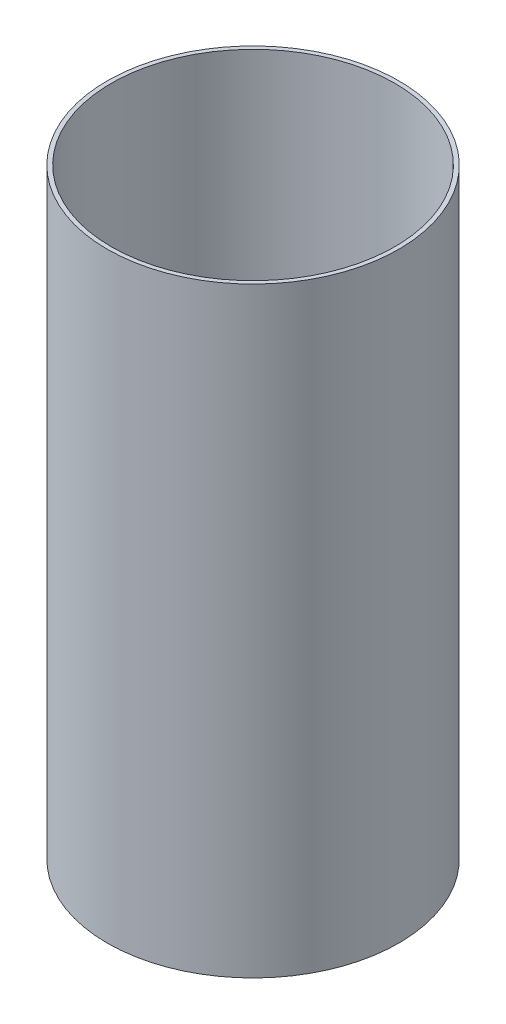
ISO-10303-21;
HEADER;
FILE_DESCRIPTION(('STEP AP214'),'2;1');
FILE_NAME('part.step','',(''),(''),'','','');
FILE_SCHEMA(('AUTOMOTIVE_DESIGN { 1 0 10303 214 1 1 1 1 }'));
ENDSEC;
DATA;
#1=APPLICATION_CONTEXT('core data for automotive mechanical design processes');
#2=APPLICATION_PROTOCOL_DEFINITION('international standard','automotive_design',2000,#1);
#3=PRODUCT_CONTEXT('',#1,'mechanical');
#4=PRODUCT('Part','Part','',(#3));
#5=PRODUCT_RELATED_PRODUCT_CATEGORY('part','',(#4));
#6=PRODUCT_DEFINITION_FORMATION('','',#4);
#7=PRODUCT_DEFINITION_CONTEXT('part definition',#1,'design');
#8=PRODUCT_DEFINITION('design','',#6,#7);
#9=PRODUCT_DEFINITION_SHAPE('','',#8);
#10=(LENGTH_UNIT() NAMED_UNIT(*) SI_UNIT(.MILLI.,.METRE.));
#11=(NAMED_UNIT(*) PLANE_ANGLE_UNIT() SI_UNIT($,.RADIAN.));
#12=(NAMED_UNIT(*) SI_UNIT($,.STERADIAN.) SOLID_ANGLE_UNIT());
#13=UNCERTAINTY_MEASURE_WITH_UNIT(LENGTH_MEASURE(1.E-05),#10,'distance_accuracy_value','');
#14=(GEOMETRIC_REPRESENTATION_CONTEXT(3) GLOBAL_UNCERTAINTY_ASSIGNED_CONTEXT((#13)) GLOBAL_UNIT_ASSIGNED_CONTEXT((#10,
#11,#12)) REPRESENTATION_CONTEXT('',''));
#15=CARTESIAN_POINT('',(0.,0.,0.));
#16=DIRECTION('',(0.,0.,1.));
#17=DIRECTION('',(1.,0.,0.));
#18=AXIS2_PLACEMENT_3D('',#15,#16,#17);
#19=CARTESIAN_POINT('',(0.,314.,0.));
#20=DIRECTION('',(0.,1.,0.));
#21=DIRECTION('',(0.,0.,1.));
#22=AXIS2_PLACEMENT_3D('',#19,#20,#21);
#23=PLANE('',#22);
#24=CARTESIAN_POINT('',(0.,314.,0.));
#25=DIRECTION('',(0.,1.,0.));
#26=DIRECTION('',(0.,0.,1.));
#27=AXIS2_PLACEMENT_3D('',#24,#25,#26);
#28=CIRCLE('',#27,76.2);
#29=CARTESIAN_POINT('',(0.,314.,76.2));
#30=VERTEX_POINT('',#29);
#31=EDGE_CURVE('E10',#30,#30,#28,.T.);
#32=ORIENTED_EDGE('',*,*,#31,.T.);
#33=EDGE_LOOP('',(#32));
#34=FACE_BOUND('',#33,.T.);
#35=CARTESIAN_POINT('',(0.,314.,0.));
#36=DIRECTION('',(0.,1.,0.));
#37=DIRECTION('',(0.,0.,1.));
#38=AXIS2_PLACEMENT_3D('',#35,#36,#37);
#39=CIRCLE('',#38,74.04);
#40=CARTESIAN_POINT('',(0.,314.,74.04));
#41=VERTEX_POINT('',#40);
#42=EDGE_CURVE('E46',#41,#41,#39,.T.);
#43=ORIENTED_EDGE('',*,*,#42,.F.);
#44=EDGE_LOOP('',(#43));
#45=FACE_BOUND('',#44,.T.);
#46=ADVANCED_FACE('F35',(#34,#45),#23,.T.);
#47=CARTESIAN_POINT('',(0.,0.,0.));
#48=DIRECTION('',(0.,1.,0.));
#49=DIRECTION('',(0.,0.,1.));
#50=AXIS2_PLACEMENT_3D('',#47,#48,#49);
#51=PLANE('',#50);
#52=CARTESIAN_POINT('',(0.,0.,0.));
#53=DIRECTION('',(0.,1.,0.));
#54=DIRECTION('',(0.,0.,1.));
#55=AXIS2_PLACEMENT_3D('',#52,#53,#54);
#56=CIRCLE('',#55,76.2);
#57=CARTESIAN_POINT('',(0.,0.,76.2));
#58=VERTEX_POINT('',#57);
#59=EDGE_CURVE('E39',#58,#58,#56,.T.);
#60=ORIENTED_EDGE('',*,*,#59,.F.);
#61=EDGE_LOOP('',(#60));
#62=FACE_BOUND('',#61,.T.);
#63=CARTESIAN_POINT('',(0.,0.,0.));
#64=DIRECTION('',(0.,1.,0.));
#65=DIRECTION('',(0.,0.,1.));
#66=AXIS2_PLACEMENT_3D('',#63,#64,#65);
#67=CIRCLE('',#66,74.04);
#68=CARTESIAN_POINT('',(0.,0.,74.04));
#69=VERTEX_POINT('',#68);
#70=EDGE_CURVE('E48',#69,#69,#67,.T.);
#71=ORIENTED_EDGE('',*,*,#70,.T.);
#72=EDGE_LOOP('',(#71));
#73=FACE_BOUND('',#72,.T.);
#74=ADVANCED_FACE('F58',(#62,#73),#51,.F.);
#75=CARTESIAN_POINT('',(0.,314.,0.));
#76=DIRECTION('',(0.,-1.,0.));
#77=DIRECTION('',(0.,0.,-1.));
#78=AXIS2_PLACEMENT_3D('',#75,#76,#77);
#79=CYLINDRICAL_SURFACE('',#78,76.2);
#80=ORIENTED_EDGE('',*,*,#31,.F.);
#81=EDGE_LOOP('',(#80));
#82=FACE_BOUND('',#81,.T.);
#83=ORIENTED_EDGE('',*,*,#59,.T.);
#84=EDGE_LOOP('',(#83));
#85=FACE_BOUND('',#84,.T.);
#86=ADVANCED_FACE('F37',(#82,#85),#79,.T.);
#87=CARTESIAN_POINT('',(0.,314.,0.));
#88=DIRECTION('',(0.,-1.,0.));
#89=DIRECTION('',(0.,0.,-1.));
#90=AXIS2_PLACEMENT_3D('',#87,#88,#89);
#91=CYLINDRICAL_SURFACE('',#90,74.04);
#92=ORIENTED_EDGE('',*,*,#42,.T.);
#93=EDGE_LOOP('',(#92));
#94=FACE_BOUND('',#93,.T.);
#95=ORIENTED_EDGE('',*,*,#70,.F.);
#96=EDGE_LOOP('',(#95));
#97=FACE_BOUND('',#96,.T.);
#98=ADVANCED_FACE('F54',(#94,#97),#91,.F.);
#99=CLOSED_SHELL('',(#46,#74,#86,#98));
#100=MANIFOLD_SOLID_BREP('B2',#99);
#101=ADVANCED_BREP_SHAPE_REPRESENTATION('',(#18,#100),#14);
#102=SHAPE_DEFINITION_REPRESENTATION(#9,#101);
ENDSEC;
END-ISO-10303-21;
